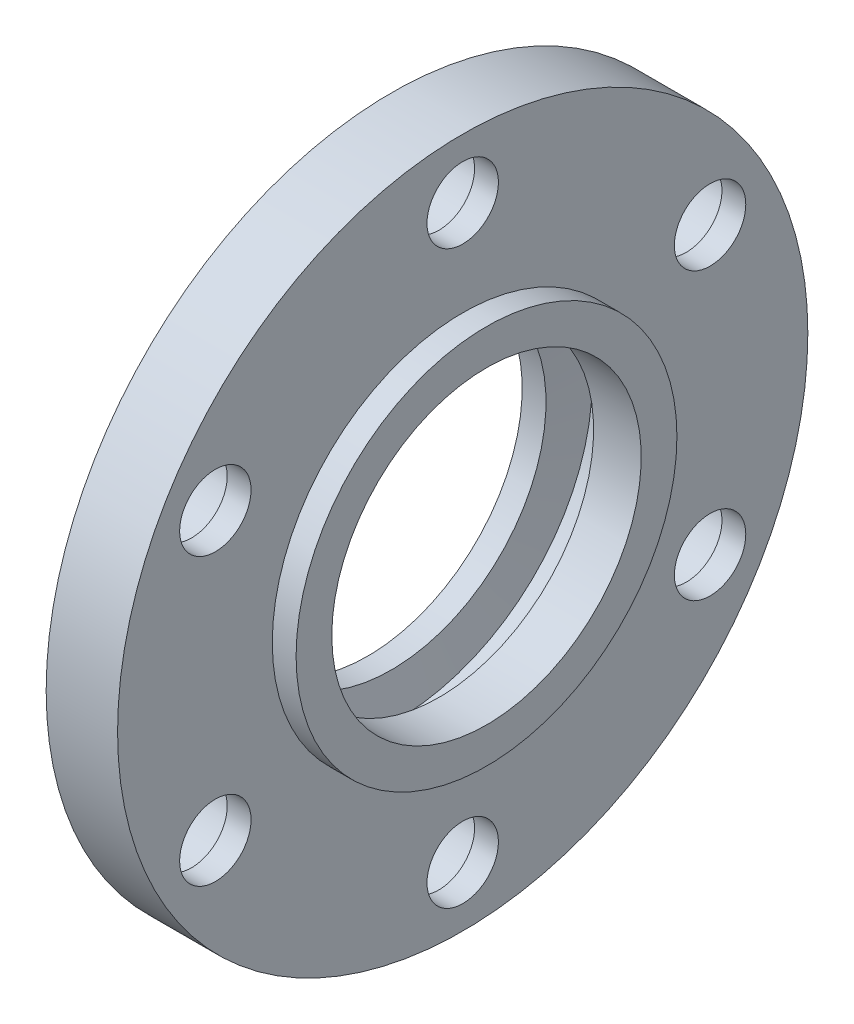
ISO-10303-21;
HEADER;
FILE_DESCRIPTION(('STEP AP214'),'2;1');
FILE_NAME('part.step','',(''),(''),'','','');
FILE_SCHEMA(('AUTOMOTIVE_DESIGN { 1 0 10303 214 1 1 1 1 }'));
ENDSEC;
DATA;
#1=APPLICATION_CONTEXT('core data for automotive mechanical design processes');
#2=APPLICATION_PROTOCOL_DEFINITION('international standard','automotive_design',2000,#1);
#3=PRODUCT_CONTEXT('',#1,'mechanical');
#4=PRODUCT('Part','Part','',(#3));
#5=PRODUCT_RELATED_PRODUCT_CATEGORY('part','',(#4));
#6=PRODUCT_DEFINITION_FORMATION('','',#4);
#7=PRODUCT_DEFINITION_CONTEXT('part definition',#1,'design');
#8=PRODUCT_DEFINITION('design','',#6,#7);
#9=PRODUCT_DEFINITION_SHAPE('','',#8);
#10=(LENGTH_UNIT() NAMED_UNIT(*) SI_UNIT(.MILLI.,.METRE.));
#11=(NAMED_UNIT(*) PLANE_ANGLE_UNIT() SI_UNIT($,.RADIAN.));
#12=(NAMED_UNIT(*) SI_UNIT($,.STERADIAN.) SOLID_ANGLE_UNIT());
#13=UNCERTAINTY_MEASURE_WITH_UNIT(LENGTH_MEASURE(1.E-05),#10,'distance_accuracy_value','');
#14=(GEOMETRIC_REPRESENTATION_CONTEXT(3) GLOBAL_UNCERTAINTY_ASSIGNED_CONTEXT((#13)) GLOBAL_UNIT_ASSIGNED_CONTEXT((#10,
#11,#12)) REPRESENTATION_CONTEXT('',''));
#15=CARTESIAN_POINT('',(0.,0.,0.));
#16=DIRECTION('',(0.,0.,1.));
#17=DIRECTION('',(1.,0.,0.));
#18=AXIS2_PLACEMENT_3D('',#15,#16,#17);
#19=CARTESIAN_POINT('',(2.,0.,0.));
#20=DIRECTION('',(1.,0.,0.));
#21=DIRECTION('',(0.,0.,-1.));
#22=AXIS2_PLACEMENT_3D('',#19,#20,#21);
#23=CYLINDRICAL_SURFACE('',#22,29.0000000000001);
#24=CARTESIAN_POINT('',(2.,0.,0.));
#25=DIRECTION('',(1.,0.,0.));
#26=DIRECTION('',(0.,0.,-1.));
#27=AXIS2_PLACEMENT_3D('',#24,#25,#26);
#28=CIRCLE('',#27,29.0000000000001);
#29=CARTESIAN_POINT('',(2.,0.,-29.0000000000001));
#30=VERTEX_POINT('',#29);
#31=EDGE_CURVE('E10',#30,#30,#28,.T.);
#32=ORIENTED_EDGE('',*,*,#31,.T.);
#33=EDGE_LOOP('',(#32));
#34=FACE_BOUND('',#33,.T.);
#35=CARTESIAN_POINT('',(8.,0.,0.));
#36=DIRECTION('',(1.,0.,0.));
#37=DIRECTION('',(0.,0.,-1.));
#38=AXIS2_PLACEMENT_3D('',#35,#36,#37);
#39=CIRCLE('',#38,29.0000000000001);
#40=CARTESIAN_POINT('',(8.,0.,-29.0000000000001));
#41=VERTEX_POINT('',#40);
#42=EDGE_CURVE('E38',#41,#41,#39,.T.);
#43=ORIENTED_EDGE('',*,*,#42,.F.);
#44=EDGE_LOOP('',(#43));
#45=FACE_BOUND('',#44,.T.);
#46=ADVANCED_FACE('F31',(#34,#45),#23,.T.);
#47=CARTESIAN_POINT('',(2.,29.0000000000001,0.));
#48=DIRECTION('',(-1.,0.,0.));
#49=DIRECTION('',(0.,0.,1.));
#50=AXIS2_PLACEMENT_3D('',#47,#48,#49);
#51=PLANE('',#50);
#52=CARTESIAN_POINT('',(2.,-12.,20.7846096908265));
#53=DIRECTION('',(-1.,0.,0.));
#54=DIRECTION('',(0.,0.,1.));
#55=AXIS2_PLACEMENT_3D('',#52,#53,#54);
#56=CIRCLE('',#55,4.25000000000001);
#57=CARTESIAN_POINT('',(2.,-12.,25.0346096908265));
#58=VERTEX_POINT('',#57);
#59=EDGE_CURVE('E268',#58,#58,#56,.T.);
#60=ORIENTED_EDGE('',*,*,#59,.F.);
#61=EDGE_LOOP('',(#60));
#62=FACE_BOUND('',#61,.T.);
#63=CARTESIAN_POINT('',(2.,-24.,0.));
#64=DIRECTION('',(-1.,0.,0.));
#65=DIRECTION('',(0.,0.,1.));
#66=AXIS2_PLACEMENT_3D('',#63,#64,#65);
#67=CIRCLE('',#66,4.25000000000001);
#68=CARTESIAN_POINT('',(2.,-24.,4.25000000000001));
#69=VERTEX_POINT('',#68);
#70=EDGE_CURVE('E81',#69,#69,#67,.T.);
#71=ORIENTED_EDGE('',*,*,#70,.F.);
#72=EDGE_LOOP('',(#71));
#73=FACE_BOUND('',#72,.T.);
#74=CARTESIAN_POINT('',(2.,-12.,-20.7846096908265));
#75=DIRECTION('',(-1.,0.,0.));
#76=DIRECTION('',(0.,0.,1.));
#77=AXIS2_PLACEMENT_3D('',#74,#75,#76);
#78=CIRCLE('',#77,4.25000000000001);
#79=CARTESIAN_POINT('',(2.,-12.,-16.5346096908265));
#80=VERTEX_POINT('',#79);
#81=EDGE_CURVE('E68',#80,#80,#78,.T.);
#82=ORIENTED_EDGE('',*,*,#81,.F.);
#83=EDGE_LOOP('',(#82));
#84=FACE_BOUND('',#83,.T.);
#85=CARTESIAN_POINT('',(2.,12.,-20.7846096908265));
#86=DIRECTION('',(-1.,0.,0.));
#87=DIRECTION('',(0.,0.,1.));
#88=AXIS2_PLACEMENT_3D('',#85,#86,#87);
#89=CIRCLE('',#88,4.25000000000001);
#90=CARTESIAN_POINT('',(2.,12.,-16.5346096908265));
#91=VERTEX_POINT('',#90);
#92=EDGE_CURVE('E64',#91,#91,#89,.T.);
#93=ORIENTED_EDGE('',*,*,#92,.F.);
#94=EDGE_LOOP('',(#93));
#95=FACE_BOUND('',#94,.T.);
#96=CARTESIAN_POINT('',(2.,24.,0.));
#97=DIRECTION('',(-1.,0.,0.));
#98=DIRECTION('',(0.,0.,1.));
#99=AXIS2_PLACEMENT_3D('',#96,#97,#98);
#100=CIRCLE('',#99,4.25000000000001);
#101=CARTESIAN_POINT('',(2.,24.,4.25000000000002));
#102=VERTEX_POINT('',#101);
#103=EDGE_CURVE('E60',#102,#102,#100,.T.);
#104=ORIENTED_EDGE('',*,*,#103,.F.);
#105=EDGE_LOOP('',(#104));
#106=FACE_BOUND('',#105,.T.);
#107=CARTESIAN_POINT('',(2.,12.,20.7846096908265));
#108=DIRECTION('',(-1.,0.,0.));
#109=DIRECTION('',(0.,0.,1.));
#110=AXIS2_PLACEMENT_3D('',#107,#108,#109);
#111=CIRCLE('',#110,4.25000000000001);
#112=CARTESIAN_POINT('',(2.,12.,25.0346096908265));
#113=VERTEX_POINT('',#112);
#114=EDGE_CURVE('E55',#113,#113,#111,.T.);
#115=ORIENTED_EDGE('',*,*,#114,.F.);
#116=EDGE_LOOP('',(#115));
#117=FACE_BOUND('',#116,.T.);
#118=CARTESIAN_POINT('',(2.,0.,0.));
#119=DIRECTION('',(-1.,0.,0.));
#120=DIRECTION('',(0.,0.,1.));
#121=AXIS2_PLACEMENT_3D('',#118,#119,#120);
#122=CIRCLE('',#121,19.5000000000001);
#123=CARTESIAN_POINT('',(2.,0.,19.5000000000001));
#124=VERTEX_POINT('',#123);
#125=EDGE_CURVE('E131',#124,#124,#122,.T.);
#126=ORIENTED_EDGE('',*,*,#125,.F.);
#127=EDGE_LOOP('',(#126));
#128=FACE_BOUND('',#127,.T.);
#129=ORIENTED_EDGE('',*,*,#31,.F.);
#130=EDGE_LOOP('',(#129));
#131=FACE_BOUND('',#130,.T.);
#132=ADVANCED_FACE('F147',(#62,#73,#84,#95,#106,#117,#128,#131),#51,.T.);
#133=CARTESIAN_POINT('',(8.,0.,0.));
#134=DIRECTION('',(1.,0.,0.));
#135=DIRECTION('',(0.,0.,-1.));
#136=AXIS2_PLACEMENT_3D('',#133,#134,#135);
#137=PLANE('',#136);
#138=CARTESIAN_POINT('',(8.,-12.,20.7846096908265));
#139=DIRECTION('',(1.,0.,0.));
#140=DIRECTION('',(0.,0.,-1.));
#141=AXIS2_PLACEMENT_3D('',#138,#139,#140);
#142=CIRCLE('',#141,3.00000000000001);
#143=CARTESIAN_POINT('',(8.,-12.,17.7846096908265));
#144=VERTEX_POINT('',#143);
#145=EDGE_CURVE('E34',#144,#144,#142,.T.);
#146=ORIENTED_EDGE('',*,*,#145,.F.);
#147=EDGE_LOOP('',(#146));
#148=FACE_BOUND('',#147,.T.);
#149=CARTESIAN_POINT('',(8.,-24.,0.));
#150=DIRECTION('',(1.,0.,0.));
#151=DIRECTION('',(0.,0.,-1.));
#152=AXIS2_PLACEMENT_3D('',#149,#150,#151);
#153=CIRCLE('',#152,3.00000000000001);
#154=CARTESIAN_POINT('',(8.,-24.,-3.00000000000001));
#155=VERTEX_POINT('',#154);
#156=EDGE_CURVE('E66',#155,#155,#153,.T.);
#157=ORIENTED_EDGE('',*,*,#156,.F.);
#158=EDGE_LOOP('',(#157));
#159=FACE_BOUND('',#158,.T.);
#160=CARTESIAN_POINT('',(8.,-12.,-20.7846096908265));
#161=DIRECTION('',(1.,0.,0.));
#162=DIRECTION('',(0.,0.,-1.));
#163=AXIS2_PLACEMENT_3D('',#160,#161,#162);
#164=CIRCLE('',#163,3.00000000000001);
#165=CARTESIAN_POINT('',(8.,-12.,-23.7846096908265));
#166=VERTEX_POINT('',#165);
#167=EDGE_CURVE('E62',#166,#166,#164,.T.);
#168=ORIENTED_EDGE('',*,*,#167,.F.);
#169=EDGE_LOOP('',(#168));
#170=FACE_BOUND('',#169,.T.);
#171=CARTESIAN_POINT('',(8.,12.,-20.7846096908265));
#172=DIRECTION('',(1.,0.,0.));
#173=DIRECTION('',(0.,0.,-1.));
#174=AXIS2_PLACEMENT_3D('',#171,#172,#173);
#175=CIRCLE('',#174,3.00000000000001);
#176=CARTESIAN_POINT('',(8.,12.,-23.7846096908265));
#177=VERTEX_POINT('',#176);
#178=EDGE_CURVE('E57',#177,#177,#175,.T.);
#179=ORIENTED_EDGE('',*,*,#178,.F.);
#180=EDGE_LOOP('',(#179));
#181=FACE_BOUND('',#180,.T.);
#182=CARTESIAN_POINT('',(8.,24.,0.));
#183=DIRECTION('',(1.,0.,0.));
#184=DIRECTION('',(0.,0.,-1.));
#185=AXIS2_PLACEMENT_3D('',#182,#183,#184);
#186=CIRCLE('',#185,3.00000000000001);
#187=CARTESIAN_POINT('',(8.,24.,-3.00000000000001));
#188=VERTEX_POINT('',#187);
#189=EDGE_CURVE('E52',#188,#188,#186,.T.);
#190=ORIENTED_EDGE('',*,*,#189,.F.);
#191=EDGE_LOOP('',(#190));
#192=FACE_BOUND('',#191,.T.);
#193=CARTESIAN_POINT('',(8.,12.,20.7846096908265));
#194=DIRECTION('',(1.,0.,0.));
#195=DIRECTION('',(0.,0.,-1.));
#196=AXIS2_PLACEMENT_3D('',#193,#194,#195);
#197=CIRCLE('',#196,3.00000000000001);
#198=CARTESIAN_POINT('',(8.,12.,17.7846096908265));
#199=VERTEX_POINT('',#198);
#200=EDGE_CURVE('E47',#199,#199,#197,.T.);
#201=ORIENTED_EDGE('',*,*,#200,.F.);
#202=EDGE_LOOP('',(#201));
#203=FACE_BOUND('',#202,.T.);
#204=CARTESIAN_POINT('',(8.,0.,0.));
#205=DIRECTION('',(1.,0.,0.));
#206=DIRECTION('',(0.,0.,-1.));
#207=AXIS2_PLACEMENT_3D('',#204,#205,#206);
#208=CIRCLE('',#207,16.);
#209=CARTESIAN_POINT('',(8.,0.,-16.));
#210=VERTEX_POINT('',#209);
#211=EDGE_CURVE('E127',#210,#210,#208,.T.);
#212=ORIENTED_EDGE('',*,*,#211,.F.);
#213=EDGE_LOOP('',(#212));
#214=FACE_BOUND('',#213,.T.);
#215=ORIENTED_EDGE('',*,*,#42,.T.);
#216=EDGE_LOOP('',(#215));
#217=FACE_BOUND('',#216,.T.);
#218=ADVANCED_FACE('F143',(#148,#159,#170,#181,#192,#203,#214,#217),#137,.T.);
#219=CARTESIAN_POINT('',(2.,0.,0.));
#220=DIRECTION('',(1.,0.,0.));
#221=DIRECTION('',(0.,0.,1.));
#222=AXIS2_PLACEMENT_3D('',#219,#220,#221);
#223=CONICAL_SURFACE('',#222,19.5000000000001,0.785398163397458);
#224=CARTESIAN_POINT('',(0.,0.,0.));
#225=DIRECTION('',(-1.,0.,0.));
#226=DIRECTION('',(0.,0.,1.));
#227=AXIS2_PLACEMENT_3D('',#224,#225,#226);
#228=CIRCLE('',#227,17.5);
#229=CARTESIAN_POINT('',(0.,0.,17.5));
#230=VERTEX_POINT('',#229);
#231=EDGE_CURVE('E43',#230,#230,#228,.T.);
#232=ORIENTED_EDGE('',*,*,#231,.F.);
#233=EDGE_LOOP('',(#232));
#234=FACE_BOUND('',#233,.T.);
#235=ORIENTED_EDGE('',*,*,#125,.T.);
#236=EDGE_LOOP('',(#235));
#237=FACE_BOUND('',#236,.T.);
#238=ADVANCED_FACE('F140',(#234,#237),#223,.T.);
#239=CARTESIAN_POINT('',(0.,0.,0.));
#240=DIRECTION('',(-1.,0.,0.));
#241=DIRECTION('',(0.,0.,1.));
#242=AXIS2_PLACEMENT_3D('',#239,#240,#241);
#243=PLANE('',#242);
#244=CARTESIAN_POINT('',(0.,0.,0.));
#245=DIRECTION('',(-1.,0.,0.));
#246=DIRECTION('',(0.,0.,1.));
#247=AXIS2_PLACEMENT_3D('',#244,#245,#246);
#248=CIRCLE('',#247,13.);
#249=CARTESIAN_POINT('',(0.,0.,13.));
#250=VERTEX_POINT('',#249);
#251=EDGE_CURVE('E121',#250,#250,#248,.T.);
#252=ORIENTED_EDGE('',*,*,#251,.F.);
#253=EDGE_LOOP('',(#252));
#254=FACE_BOUND('',#253,.T.);
#255=ORIENTED_EDGE('',*,*,#231,.T.);
#256=EDGE_LOOP('',(#255));
#257=FACE_BOUND('',#256,.T.);
#258=ADVANCED_FACE('F138',(#254,#257),#243,.T.);
#259=CARTESIAN_POINT('',(10.,0.,0.));
#260=DIRECTION('',(-1.,0.,0.));
#261=DIRECTION('',(0.,0.,1.));
#262=AXIS2_PLACEMENT_3D('',#259,#260,#261);
#263=CYLINDRICAL_SURFACE('',#262,16.);
#264=CARTESIAN_POINT('',(10.,0.,0.));
#265=DIRECTION('',(1.,0.,0.));
#266=DIRECTION('',(0.,0.,-1.));
#267=AXIS2_PLACEMENT_3D('',#264,#265,#266);
#268=CIRCLE('',#267,16.);
#269=CARTESIAN_POINT('',(10.,0.,-16.));
#270=VERTEX_POINT('',#269);
#271=EDGE_CURVE('E128',#270,#270,#268,.T.);
#272=ORIENTED_EDGE('',*,*,#271,.F.);
#273=EDGE_LOOP('',(#272));
#274=FACE_BOUND('',#273,.T.);
#275=ORIENTED_EDGE('',*,*,#211,.T.);
#276=EDGE_LOOP('',(#275));
#277=FACE_BOUND('',#276,.T.);
#278=ADVANCED_FACE('F162',(#274,#277),#263,.T.);
#279=CARTESIAN_POINT('',(10.,0.,0.));
#280=DIRECTION('',(1.,0.,0.));
#281=DIRECTION('',(0.,0.,-1.));
#282=AXIS2_PLACEMENT_3D('',#279,#280,#281);
#283=PLANE('',#282);
#284=CARTESIAN_POINT('',(10.,0.,0.));
#285=DIRECTION('',(-1.,0.,0.));
#286=DIRECTION('',(0.,0.,1.));
#287=AXIS2_PLACEMENT_3D('',#284,#285,#286);
#288=CIRCLE('',#287,13.);
#289=CARTESIAN_POINT('',(10.,0.,13.));
#290=VERTEX_POINT('',#289);
#291=EDGE_CURVE('E124',#290,#290,#288,.T.);
#292=ORIENTED_EDGE('',*,*,#291,.T.);
#293=EDGE_LOOP('',(#292));
#294=FACE_BOUND('',#293,.T.);
#295=ORIENTED_EDGE('',*,*,#271,.T.);
#296=EDGE_LOOP('',(#295));
#297=FACE_BOUND('',#296,.T.);
#298=ADVANCED_FACE('F166',(#294,#297),#283,.T.);
#299=CARTESIAN_POINT('',(10.,0.,0.));
#300=DIRECTION('',(-1.,0.,0.));
#301=DIRECTION('',(0.,0.,1.));
#302=AXIS2_PLACEMENT_3D('',#299,#300,#301);
#303=CYLINDRICAL_SURFACE('',#302,13.);
#304=ORIENTED_EDGE('',*,*,#291,.F.);
#305=EDGE_LOOP('',(#304));
#306=FACE_BOUND('',#305,.T.);
#307=CARTESIAN_POINT('',(6.00000000000001,0.,0.));
#308=DIRECTION('',(-1.,0.,0.));
#309=DIRECTION('',(0.,0.,1.));
#310=AXIS2_PLACEMENT_3D('',#307,#308,#309);
#311=CIRCLE('',#310,13.);
#312=CARTESIAN_POINT('',(6.00000000000001,0.,13.));
#313=VERTEX_POINT('',#312);
#314=EDGE_CURVE('E50',#313,#313,#311,.T.);
#315=ORIENTED_EDGE('',*,*,#314,.T.);
#316=EDGE_LOOP('',(#315));
#317=FACE_BOUND('',#316,.T.);
#318=ADVANCED_FACE('F170',(#306,#317),#303,.F.);
#319=CARTESIAN_POINT('',(10.,0.,0.));
#320=DIRECTION('',(-1.,0.,0.));
#321=DIRECTION('',(0.,0.,1.));
#322=AXIS2_PLACEMENT_3D('',#319,#320,#321);
#323=CYLINDRICAL_SURFACE('',#322,13.);
#324=CARTESIAN_POINT('',(2.,0.,0.));
#325=DIRECTION('',(-1.,0.,0.));
#326=DIRECTION('',(0.,0.,1.));
#327=AXIS2_PLACEMENT_3D('',#324,#325,#326);
#328=CIRCLE('',#327,13.);
#329=CARTESIAN_POINT('',(2.,0.,13.));
#330=VERTEX_POINT('',#329);
#331=EDGE_CURVE('E118',#330,#330,#328,.T.);
#332=ORIENTED_EDGE('',*,*,#331,.F.);
#333=EDGE_LOOP('',(#332));
#334=FACE_BOUND('',#333,.T.);
#335=ORIENTED_EDGE('',*,*,#251,.T.);
#336=EDGE_LOOP('',(#335));
#337=FACE_BOUND('',#336,.T.);
#338=ADVANCED_FACE('F174',(#334,#337),#323,.F.);
#339=CARTESIAN_POINT('',(2.,0.,0.));
#340=DIRECTION('',(1.,0.,0.));
#341=DIRECTION('',(0.,0.,-1.));
#342=AXIS2_PLACEMENT_3D('',#339,#340,#341);
#343=CONICAL_SURFACE('',#342,13.,1.42365742036362);
#344=CARTESIAN_POINT('',(2.50000000000001,0.,0.));
#345=DIRECTION('',(-1.,0.,0.));
#346=DIRECTION('',(0.,0.,1.));
#347=AXIS2_PLACEMENT_3D('',#344,#345,#346);
#348=CIRCLE('',#347,16.3735908719696);
#349=CARTESIAN_POINT('',(2.50000000000001,0.,16.3735908719696));
#350=VERTEX_POINT('',#349);
#351=EDGE_CURVE('E115',#350,#350,#348,.T.);
#352=ORIENTED_EDGE('',*,*,#351,.F.);
#353=EDGE_LOOP('',(#352));
#354=FACE_BOUND('',#353,.T.);
#355=ORIENTED_EDGE('',*,*,#331,.T.);
#356=EDGE_LOOP('',(#355));
#357=FACE_BOUND('',#356,.T.);
#358=ADVANCED_FACE('F178',(#354,#357),#343,.F.);
#359=CARTESIAN_POINT('',(10.,0.,0.));
#360=DIRECTION('',(-1.,0.,0.));
#361=DIRECTION('',(0.,0.,1.));
#362=AXIS2_PLACEMENT_3D('',#359,#360,#361);
#363=CYLINDRICAL_SURFACE('',#362,16.3735908719696);
#364=CARTESIAN_POINT('',(5.5,0.,0.));
#365=DIRECTION('',(-1.,0.,0.));
#366=DIRECTION('',(0.,0.,1.));
#367=AXIS2_PLACEMENT_3D('',#364,#365,#366);
#368=CIRCLE('',#367,16.3735908719696);
#369=CARTESIAN_POINT('',(5.5,0.,16.3735908719696));
#370=VERTEX_POINT('',#369);
#371=EDGE_CURVE('E112',#370,#370,#368,.T.);
#372=ORIENTED_EDGE('',*,*,#371,.F.);
#373=EDGE_LOOP('',(#372));
#374=FACE_BOUND('',#373,.T.);
#375=ORIENTED_EDGE('',*,*,#351,.T.);
#376=EDGE_LOOP('',(#375));
#377=FACE_BOUND('',#376,.T.);
#378=ADVANCED_FACE('F182',(#374,#377),#363,.F.);
#379=CARTESIAN_POINT('',(5.5,0.,0.));
#380=DIRECTION('',(-1.,0.,0.));
#381=DIRECTION('',(0.,0.,1.));
#382=AXIS2_PLACEMENT_3D('',#379,#380,#381);
#383=CONICAL_SURFACE('',#382,16.3735908719696,1.42365742036362);
#384=ORIENTED_EDGE('',*,*,#314,.F.);
#385=EDGE_LOOP('',(#384));
#386=FACE_BOUND('',#385,.T.);
#387=ORIENTED_EDGE('',*,*,#371,.T.);
#388=EDGE_LOOP('',(#387));
#389=FACE_BOUND('',#388,.T.);
#390=ADVANCED_FACE('F186',(#386,#389),#383,.F.);
#391=CARTESIAN_POINT('',(2.,12.,20.7846096908265));
#392=DIRECTION('',(-1.,0.,0.));
#393=DIRECTION('',(0.,0.,1.));
#394=AXIS2_PLACEMENT_3D('',#391,#392,#393);
#395=CYLINDRICAL_SURFACE('',#394,3.00000000000001);
#396=ORIENTED_EDGE('',*,*,#200,.T.);
#397=EDGE_LOOP('',(#396));
#398=FACE_BOUND('',#397,.T.);
#399=CARTESIAN_POINT('',(6.,12.,20.7846096908265));
#400=DIRECTION('',(-1.,0.,0.));
#401=DIRECTION('',(0.,0.,1.));
#402=AXIS2_PLACEMENT_3D('',#399,#400,#401);
#403=CIRCLE('',#402,3.00000000000001);
#404=CARTESIAN_POINT('',(6.,12.,23.7846096908265));
#405=VERTEX_POINT('',#404);
#406=EDGE_CURVE('E51',#405,#405,#403,.T.);
#407=ORIENTED_EDGE('',*,*,#406,.T.);
#408=EDGE_LOOP('',(#407));
#409=FACE_BOUND('',#408,.T.);
#410=ADVANCED_FACE('F190',(#398,#409),#395,.F.);
#411=CARTESIAN_POINT('',(6.,15.,20.7846096908265));
#412=DIRECTION('',(1.,0.,0.));
#413=DIRECTION('',(0.,0.,-1.));
#414=AXIS2_PLACEMENT_3D('',#411,#412,#413);
#415=PLANE('',#414);
#416=ORIENTED_EDGE('',*,*,#406,.F.);
#417=EDGE_LOOP('',(#416));
#418=FACE_BOUND('',#417,.T.);
#419=CARTESIAN_POINT('',(6.,12.,20.7846096908265));
#420=DIRECTION('',(-1.,0.,0.));
#421=DIRECTION('',(0.,0.,1.));
#422=AXIS2_PLACEMENT_3D('',#419,#420,#421);
#423=CIRCLE('',#422,4.25000000000001);
#424=CARTESIAN_POINT('',(6.,12.,25.0346096908265));
#425=VERTEX_POINT('',#424);
#426=EDGE_CURVE('E105',#425,#425,#423,.T.);
#427=ORIENTED_EDGE('',*,*,#426,.T.);
#428=EDGE_LOOP('',(#427));
#429=FACE_BOUND('',#428,.T.);
#430=ADVANCED_FACE('F194',(#418,#429),#415,.F.);
#431=CARTESIAN_POINT('',(2.,12.,20.7846096908265));
#432=DIRECTION('',(-1.,0.,0.));
#433=DIRECTION('',(0.,0.,1.));
#434=AXIS2_PLACEMENT_3D('',#431,#432,#433);
#435=CYLINDRICAL_SURFACE('',#434,4.25000000000001);
#436=ORIENTED_EDGE('',*,*,#426,.F.);
#437=EDGE_LOOP('',(#436));
#438=FACE_BOUND('',#437,.T.);
#439=ORIENTED_EDGE('',*,*,#114,.T.);
#440=EDGE_LOOP('',(#439));
#441=FACE_BOUND('',#440,.T.);
#442=ADVANCED_FACE('F198',(#438,#441),#435,.F.);
#443=CARTESIAN_POINT('',(2.,24.,0.));
#444=DIRECTION('',(-1.,0.,0.));
#445=DIRECTION('',(0.,0.,1.));
#446=AXIS2_PLACEMENT_3D('',#443,#444,#445);
#447=CYLINDRICAL_SURFACE('',#446,3.00000000000001);
#448=ORIENTED_EDGE('',*,*,#189,.T.);
#449=EDGE_LOOP('',(#448));
#450=FACE_BOUND('',#449,.T.);
#451=CARTESIAN_POINT('',(6.,24.,0.));
#452=DIRECTION('',(-1.,0.,0.));
#453=DIRECTION('',(0.,0.,1.));
#454=AXIS2_PLACEMENT_3D('',#451,#452,#453);
#455=CIRCLE('',#454,3.00000000000001);
#456=CARTESIAN_POINT('',(6.,24.,3.00000000000002));
#457=VERTEX_POINT('',#456);
#458=EDGE_CURVE('E56',#457,#457,#455,.T.);
#459=ORIENTED_EDGE('',*,*,#458,.T.);
#460=EDGE_LOOP('',(#459));
#461=FACE_BOUND('',#460,.T.);
#462=ADVANCED_FACE('F202',(#450,#461),#447,.F.);
#463=CARTESIAN_POINT('',(6.,27.,0.));
#464=DIRECTION('',(1.,0.,0.));
#465=DIRECTION('',(0.,0.,-1.));
#466=AXIS2_PLACEMENT_3D('',#463,#464,#465);
#467=PLANE('',#466);
#468=ORIENTED_EDGE('',*,*,#458,.F.);
#469=EDGE_LOOP('',(#468));
#470=FACE_BOUND('',#469,.T.);
#471=CARTESIAN_POINT('',(6.,24.,0.));
#472=DIRECTION('',(-1.,0.,0.));
#473=DIRECTION('',(0.,0.,1.));
#474=AXIS2_PLACEMENT_3D('',#471,#472,#473);
#475=CIRCLE('',#474,4.25000000000001);
#476=CARTESIAN_POINT('',(6.,24.,4.25000000000002));
#477=VERTEX_POINT('',#476);
#478=EDGE_CURVE('E98',#477,#477,#475,.T.);
#479=ORIENTED_EDGE('',*,*,#478,.T.);
#480=EDGE_LOOP('',(#479));
#481=FACE_BOUND('',#480,.T.);
#482=ADVANCED_FACE('F206',(#470,#481),#467,.F.);
#483=CARTESIAN_POINT('',(2.,24.,0.));
#484=DIRECTION('',(-1.,0.,0.));
#485=DIRECTION('',(0.,0.,1.));
#486=AXIS2_PLACEMENT_3D('',#483,#484,#485);
#487=CYLINDRICAL_SURFACE('',#486,4.25000000000001);
#488=ORIENTED_EDGE('',*,*,#478,.F.);
#489=EDGE_LOOP('',(#488));
#490=FACE_BOUND('',#489,.T.);
#491=ORIENTED_EDGE('',*,*,#103,.T.);
#492=EDGE_LOOP('',(#491));
#493=FACE_BOUND('',#492,.T.);
#494=ADVANCED_FACE('F210',(#490,#493),#487,.F.);
#495=CARTESIAN_POINT('',(2.,12.,-20.7846096908265));
#496=DIRECTION('',(-1.,0.,0.));
#497=DIRECTION('',(0.,0.,1.));
#498=AXIS2_PLACEMENT_3D('',#495,#496,#497);
#499=CYLINDRICAL_SURFACE('',#498,3.00000000000001);
#500=ORIENTED_EDGE('',*,*,#178,.T.);
#501=EDGE_LOOP('',(#500));
#502=FACE_BOUND('',#501,.T.);
#503=CARTESIAN_POINT('',(6.,12.,-20.7846096908265));
#504=DIRECTION('',(-1.,0.,0.));
#505=DIRECTION('',(0.,0.,1.));
#506=AXIS2_PLACEMENT_3D('',#503,#504,#505);
#507=CIRCLE('',#506,3.00000000000001);
#508=CARTESIAN_POINT('',(6.,12.,-17.7846096908265));
#509=VERTEX_POINT('',#508);
#510=EDGE_CURVE('E61',#509,#509,#507,.T.);
#511=ORIENTED_EDGE('',*,*,#510,.T.);
#512=EDGE_LOOP('',(#511));
#513=FACE_BOUND('',#512,.T.);
#514=ADVANCED_FACE('F214',(#502,#513),#499,.F.);
#515=CARTESIAN_POINT('',(6.,15.,-20.7846096908265));
#516=DIRECTION('',(1.,0.,0.));
#517=DIRECTION('',(0.,0.,-1.));
#518=AXIS2_PLACEMENT_3D('',#515,#516,#517);
#519=PLANE('',#518);
#520=ORIENTED_EDGE('',*,*,#510,.F.);
#521=EDGE_LOOP('',(#520));
#522=FACE_BOUND('',#521,.T.);
#523=CARTESIAN_POINT('',(6.,12.,-20.7846096908265));
#524=DIRECTION('',(-1.,0.,0.));
#525=DIRECTION('',(0.,0.,1.));
#526=AXIS2_PLACEMENT_3D('',#523,#524,#525);
#527=CIRCLE('',#526,4.25000000000001);
#528=CARTESIAN_POINT('',(6.,12.,-16.5346096908265));
#529=VERTEX_POINT('',#528);
#530=EDGE_CURVE('E91',#529,#529,#527,.T.);
#531=ORIENTED_EDGE('',*,*,#530,.T.);
#532=EDGE_LOOP('',(#531));
#533=FACE_BOUND('',#532,.T.);
#534=ADVANCED_FACE('F218',(#522,#533),#519,.F.);
#535=CARTESIAN_POINT('',(2.,12.,-20.7846096908265));
#536=DIRECTION('',(-1.,0.,0.));
#537=DIRECTION('',(0.,0.,1.));
#538=AXIS2_PLACEMENT_3D('',#535,#536,#537);
#539=CYLINDRICAL_SURFACE('',#538,4.25000000000001);
#540=ORIENTED_EDGE('',*,*,#530,.F.);
#541=EDGE_LOOP('',(#540));
#542=FACE_BOUND('',#541,.T.);
#543=ORIENTED_EDGE('',*,*,#92,.T.);
#544=EDGE_LOOP('',(#543));
#545=FACE_BOUND('',#544,.T.);
#546=ADVANCED_FACE('F222',(#542,#545),#539,.F.);
#547=CARTESIAN_POINT('',(2.,-12.,-20.7846096908265));
#548=DIRECTION('',(-1.,0.,0.));
#549=DIRECTION('',(0.,0.,1.));
#550=AXIS2_PLACEMENT_3D('',#547,#548,#549);
#551=CYLINDRICAL_SURFACE('',#550,3.00000000000001);
#552=ORIENTED_EDGE('',*,*,#167,.T.);
#553=EDGE_LOOP('',(#552));
#554=FACE_BOUND('',#553,.T.);
#555=CARTESIAN_POINT('',(6.,-12.,-20.7846096908265));
#556=DIRECTION('',(-1.,0.,0.));
#557=DIRECTION('',(0.,0.,1.));
#558=AXIS2_PLACEMENT_3D('',#555,#556,#557);
#559=CIRCLE('',#558,3.00000000000001);
#560=CARTESIAN_POINT('',(6.,-12.,-17.7846096908265));
#561=VERTEX_POINT('',#560);
#562=EDGE_CURVE('E65',#561,#561,#559,.T.);
#563=ORIENTED_EDGE('',*,*,#562,.T.);
#564=EDGE_LOOP('',(#563));
#565=FACE_BOUND('',#564,.T.);
#566=ADVANCED_FACE('F226',(#554,#565),#551,.F.);
#567=CARTESIAN_POINT('',(6.,-8.99999999999999,-20.7846096908265));
#568=DIRECTION('',(1.,0.,0.));
#569=DIRECTION('',(0.,0.,-1.));
#570=AXIS2_PLACEMENT_3D('',#567,#568,#569);
#571=PLANE('',#570);
#572=ORIENTED_EDGE('',*,*,#562,.F.);
#573=EDGE_LOOP('',(#572));
#574=FACE_BOUND('',#573,.T.);
#575=CARTESIAN_POINT('',(6.,-12.,-20.7846096908265));
#576=DIRECTION('',(-1.,0.,0.));
#577=DIRECTION('',(0.,0.,1.));
#578=AXIS2_PLACEMENT_3D('',#575,#576,#577);
#579=CIRCLE('',#578,4.25000000000001);
#580=CARTESIAN_POINT('',(6.,-12.,-16.5346096908265));
#581=VERTEX_POINT('',#580);
#582=EDGE_CURVE('E73',#581,#581,#579,.T.);
#583=ORIENTED_EDGE('',*,*,#582,.T.);
#584=EDGE_LOOP('',(#583));
#585=FACE_BOUND('',#584,.T.);
#586=ADVANCED_FACE('F230',(#574,#585),#571,.F.);
#587=CARTESIAN_POINT('',(2.,-12.,-20.7846096908265));
#588=DIRECTION('',(-1.,0.,0.));
#589=DIRECTION('',(0.,0.,1.));
#590=AXIS2_PLACEMENT_3D('',#587,#588,#589);
#591=CYLINDRICAL_SURFACE('',#590,4.25000000000001);
#592=ORIENTED_EDGE('',*,*,#582,.F.);
#593=EDGE_LOOP('',(#592));
#594=FACE_BOUND('',#593,.T.);
#595=ORIENTED_EDGE('',*,*,#81,.T.);
#596=EDGE_LOOP('',(#595));
#597=FACE_BOUND('',#596,.T.);
#598=ADVANCED_FACE('F234',(#594,#597),#591,.F.);
#599=CARTESIAN_POINT('',(2.,-24.,0.));
#600=DIRECTION('',(-1.,0.,0.));
#601=DIRECTION('',(0.,0.,1.));
#602=AXIS2_PLACEMENT_3D('',#599,#600,#601);
#603=CYLINDRICAL_SURFACE('',#602,3.00000000000001);
#604=ORIENTED_EDGE('',*,*,#156,.T.);
#605=EDGE_LOOP('',(#604));
#606=FACE_BOUND('',#605,.T.);
#607=CARTESIAN_POINT('',(6.,-24.,0.));
#608=DIRECTION('',(-1.,0.,0.));
#609=DIRECTION('',(0.,0.,1.));
#610=AXIS2_PLACEMENT_3D('',#607,#608,#609);
#611=CIRCLE('',#610,3.00000000000001);
#612=CARTESIAN_POINT('',(6.,-24.,3.00000000000001));
#613=VERTEX_POINT('',#612);
#614=EDGE_CURVE('E69',#613,#613,#611,.T.);
#615=ORIENTED_EDGE('',*,*,#614,.T.);
#616=EDGE_LOOP('',(#615));
#617=FACE_BOUND('',#616,.T.);
#618=ADVANCED_FACE('F238',(#606,#617),#603,.F.);
#619=CARTESIAN_POINT('',(6.,-21.,0.));
#620=DIRECTION('',(1.,0.,0.));
#621=DIRECTION('',(0.,0.,-1.));
#622=AXIS2_PLACEMENT_3D('',#619,#620,#621);
#623=PLANE('',#622);
#624=ORIENTED_EDGE('',*,*,#614,.F.);
#625=EDGE_LOOP('',(#624));
#626=FACE_BOUND('',#625,.T.);
#627=CARTESIAN_POINT('',(6.,-24.,0.));
#628=DIRECTION('',(-1.,0.,0.));
#629=DIRECTION('',(0.,0.,1.));
#630=AXIS2_PLACEMENT_3D('',#627,#628,#629);
#631=CIRCLE('',#630,4.25000000000001);
#632=CARTESIAN_POINT('',(6.,-24.,4.25000000000001));
#633=VERTEX_POINT('',#632);
#634=EDGE_CURVE('E76',#633,#633,#631,.T.);
#635=ORIENTED_EDGE('',*,*,#634,.T.);
#636=EDGE_LOOP('',(#635));
#637=FACE_BOUND('',#636,.T.);
#638=ADVANCED_FACE('F242',(#626,#637),#623,.F.);
#639=CARTESIAN_POINT('',(2.,-24.,0.));
#640=DIRECTION('',(-1.,0.,0.));
#641=DIRECTION('',(0.,0.,1.));
#642=AXIS2_PLACEMENT_3D('',#639,#640,#641);
#643=CYLINDRICAL_SURFACE('',#642,4.25000000000001);
#644=ORIENTED_EDGE('',*,*,#634,.F.);
#645=EDGE_LOOP('',(#644));
#646=FACE_BOUND('',#645,.T.);
#647=ORIENTED_EDGE('',*,*,#70,.T.);
#648=EDGE_LOOP('',(#647));
#649=FACE_BOUND('',#648,.T.);
#650=ADVANCED_FACE('F245',(#646,#649),#643,.F.);
#651=CARTESIAN_POINT('',(2.,-12.,20.7846096908265));
#652=DIRECTION('',(-1.,0.,0.));
#653=DIRECTION('',(0.,0.,1.));
#654=AXIS2_PLACEMENT_3D('',#651,#652,#653);
#655=CYLINDRICAL_SURFACE('',#654,3.00000000000001);
#656=ORIENTED_EDGE('',*,*,#145,.T.);
#657=EDGE_LOOP('',(#656));
#658=FACE_BOUND('',#657,.T.);
#659=CARTESIAN_POINT('',(6.,-12.,20.7846096908265));
#660=DIRECTION('',(-1.,0.,0.));
#661=DIRECTION('',(0.,0.,1.));
#662=AXIS2_PLACEMENT_3D('',#659,#660,#661);
#663=CIRCLE('',#662,3.00000000000001);
#664=CARTESIAN_POINT('',(6.,-12.,23.7846096908265));
#665=VERTEX_POINT('',#664);
#666=EDGE_CURVE('E270',#665,#665,#663,.T.);
#667=ORIENTED_EDGE('',*,*,#666,.T.);
#668=EDGE_LOOP('',(#667));
#669=FACE_BOUND('',#668,.T.);
#670=ADVANCED_FACE('F249',(#658,#669),#655,.F.);
#671=CARTESIAN_POINT('',(6.,-8.99999999999999,20.7846096908265));
#672=DIRECTION('',(1.,0.,0.));
#673=DIRECTION('',(0.,0.,-1.));
#674=AXIS2_PLACEMENT_3D('',#671,#672,#673);
#675=PLANE('',#674);
#676=ORIENTED_EDGE('',*,*,#666,.F.);
#677=EDGE_LOOP('',(#676));
#678=FACE_BOUND('',#677,.T.);
#679=CARTESIAN_POINT('',(6.,-12.,20.7846096908265));
#680=DIRECTION('',(-1.,0.,0.));
#681=DIRECTION('',(0.,0.,1.));
#682=AXIS2_PLACEMENT_3D('',#679,#680,#681);
#683=CIRCLE('',#682,4.25000000000001);
#684=CARTESIAN_POINT('',(6.,-12.,25.0346096908265));
#685=VERTEX_POINT('',#684);
#686=EDGE_CURVE('E266',#685,#685,#683,.T.);
#687=ORIENTED_EDGE('',*,*,#686,.T.);
#688=EDGE_LOOP('',(#687));
#689=FACE_BOUND('',#688,.T.);
#690=ADVANCED_FACE('F253',(#678,#689),#675,.F.);
#691=CARTESIAN_POINT('',(2.,-12.,20.7846096908265));
#692=DIRECTION('',(-1.,0.,0.));
#693=DIRECTION('',(0.,0.,1.));
#694=AXIS2_PLACEMENT_3D('',#691,#692,#693);
#695=CYLINDRICAL_SURFACE('',#694,4.25000000000001);
#696=ORIENTED_EDGE('',*,*,#686,.F.);
#697=EDGE_LOOP('',(#696));
#698=FACE_BOUND('',#697,.T.);
#699=ORIENTED_EDGE('',*,*,#59,.T.);
#700=EDGE_LOOP('',(#699));
#701=FACE_BOUND('',#700,.T.);
#702=ADVANCED_FACE('F257',(#698,#701),#695,.F.);
#703=CLOSED_SHELL('',(#46,#132,#218,#238,#258,#278,#298,#318,#338,#358,#378,#390,#410,#430,#442,
#462,#482,#494,#514,#534,#546,#566,#586,#598,#618,#638,#650,#670,#690,#702));
#704=MANIFOLD_SOLID_BREP('B2',#703);
#705=ADVANCED_BREP_SHAPE_REPRESENTATION('',(#18,#704),#14);
#706=SHAPE_DEFINITION_REPRESENTATION(#9,#705);
ENDSEC;
END-ISO-10303-21;
